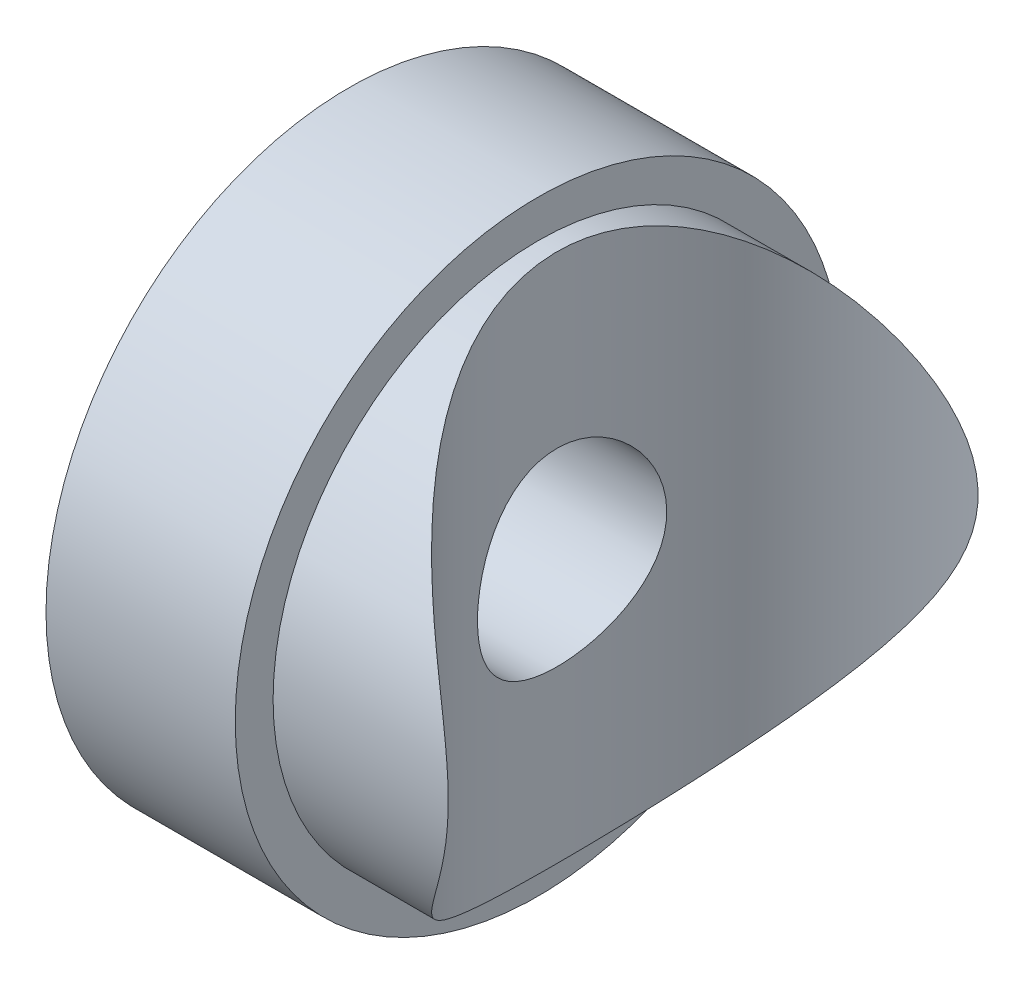
ISO-10303-21;
HEADER;
FILE_DESCRIPTION(('STEP AP214'),'2;1');
FILE_NAME('part.step','',(''),(''),'','','');
FILE_SCHEMA(('AUTOMOTIVE_DESIGN { 1 0 10303 214 1 1 1 1 }'));
ENDSEC;
DATA;
#1=APPLICATION_CONTEXT('core data for automotive mechanical design processes');
#2=APPLICATION_PROTOCOL_DEFINITION('international standard','automotive_design',2000,#1);
#3=PRODUCT_CONTEXT('',#1,'mechanical');
#4=PRODUCT('Part','Part','',(#3));
#5=PRODUCT_RELATED_PRODUCT_CATEGORY('part','',(#4));
#6=PRODUCT_DEFINITION_FORMATION('','',#4);
#7=PRODUCT_DEFINITION_CONTEXT('part definition',#1,'design');
#8=PRODUCT_DEFINITION('design','',#6,#7);
#9=PRODUCT_DEFINITION_SHAPE('','',#8);
#10=(LENGTH_UNIT() NAMED_UNIT(*) SI_UNIT(.MILLI.,.METRE.));
#11=(NAMED_UNIT(*) PLANE_ANGLE_UNIT() SI_UNIT($,.RADIAN.));
#12=(NAMED_UNIT(*) SI_UNIT($,.STERADIAN.) SOLID_ANGLE_UNIT());
#13=UNCERTAINTY_MEASURE_WITH_UNIT(LENGTH_MEASURE(1.E-05),#10,'distance_accuracy_value','');
#14=(GEOMETRIC_REPRESENTATION_CONTEXT(3) GLOBAL_UNCERTAINTY_ASSIGNED_CONTEXT((#13)) GLOBAL_UNIT_ASSIGNED_CONTEXT((#10,
#11,#12)) REPRESENTATION_CONTEXT('',''));
#15=CARTESIAN_POINT('',(0.,0.,0.));
#16=DIRECTION('',(0.,0.,1.));
#17=DIRECTION('',(1.,0.,0.));
#18=AXIS2_PLACEMENT_3D('',#15,#16,#17);
#19=CARTESIAN_POINT('',(10.,0.,0.));
#20=DIRECTION('',(-1.,0.,0.));
#21=DIRECTION('',(0.,0.,1.));
#22=AXIS2_PLACEMENT_3D('',#19,#20,#21);
#23=CYLINDRICAL_SURFACE('',#22,7.);
#24=CARTESIAN_POINT('',(5.,0.,0.));
#25=DIRECTION('',(1.,0.,0.));
#26=DIRECTION('',(0.,0.,-1.));
#27=AXIS2_PLACEMENT_3D('',#24,#25,#26);
#28=CIRCLE('',#27,7.);
#29=CARTESIAN_POINT('',(5.,0.,-7.));
#30=VERTEX_POINT('',#29);
#31=EDGE_CURVE('E10',#30,#30,#28,.T.);
#32=ORIENTED_EDGE('',*,*,#31,.T.);
#33=EDGE_LOOP('',(#32));
#34=FACE_BOUND('',#33,.T.);
#35=CARTESIAN_POINT('',(9.62701665379258,0.,7.));
#36=CARTESIAN_POINT('',(9.6270161893934,-0.112635120053914,6.99999990280088));
#37=CARTESIAN_POINT('',(9.62207662224521,-0.225276071829236,6.99727361293993));
#38=CARTESIAN_POINT('',(9.60262444537792,-0.44946347021676,6.98645716794617));
#39=CARTESIAN_POINT('',(9.58811057177819,-0.561009770353444,6.97836630464849));
#40=CARTESIAN_POINT('',(9.55029476786913,-0.782370565924877,6.95703212430416));
#41=CARTESIAN_POINT('',(9.52697070708794,-0.892179968639739,6.94377582944412));
#42=CARTESIAN_POINT('',(9.47268280425419,-1.10920553657356,6.91243058029004));
#43=CARTESIAN_POINT('',(9.44171551622252,-1.21642050807585,6.89433944588414));
#44=CARTESIAN_POINT('',(9.35824954259908,-1.47477779954107,6.84464631972935));
#45=CARTESIAN_POINT('',(9.30229047260988,-1.6243328338003,6.81060969457022));
#46=CARTESIAN_POINT('',(9.1805535771152,-1.91712809410421,6.73405916564464));
#47=CARTESIAN_POINT('',(9.11477009791143,-2.06036462211963,6.69154037584539));
#48=CARTESIAN_POINT('',(8.976035056318,-2.34119793329235,6.59854040865439));
#49=CARTESIAN_POINT('',(8.90306211289654,-2.47877605724334,6.548035193139));
#50=CARTESIAN_POINT('',(8.75234702954424,-2.74820952678169,6.43959822124493));
#51=CARTESIAN_POINT('',(8.6746052872024,-2.88006534789365,6.38166708354991));
#52=CARTESIAN_POINT('',(8.46925600058603,-3.21478348811669,6.2223002548636));
#53=CARTESIAN_POINT('',(8.33930354511534,-3.41361232707053,6.11537102512587));
#54=CARTESIAN_POINT('',(8.07673600323612,-3.79889200514321,5.88378649736237));
#55=CARTESIAN_POINT('',(7.94411950912536,-3.98533606333489,5.75912160414303));
#56=CARTESIAN_POINT('',(7.6801328152984,-4.3457884248516,5.49220564649428));
#57=CARTESIAN_POINT('',(7.5487614599441,-4.51980949609159,5.34997306042188));
#58=CARTESIAN_POINT('',(7.29038117653143,-4.85496793335145,5.04779343624745));
#59=CARTESIAN_POINT('',(7.16337031812721,-5.01611104337664,4.88785437262435));
#60=CARTESIAN_POINT('',(6.85003662867146,-5.40761857847979,4.45885019360531));
#61=CARTESIAN_POINT('',(6.66851862960557,-5.62864661784303,4.17732972773605));
#62=CARTESIAN_POINT('',(6.41748420062816,-5.93001138852198,3.72396024862766));
#63=CARTESIAN_POINT('',(6.33737033238595,-6.02540920449009,3.5677145559082));
#64=CARTESIAN_POINT('',(6.18553393985984,-6.20513864516031,3.24504548036905));
#65=CARTESIAN_POINT('',(6.11380971992169,-6.28947250644825,3.07862416456165));
#66=CARTESIAN_POINT('',(5.99276088261414,-6.43115248073762,2.76833531702067));
#67=CARTESIAN_POINT('',(5.94175629855027,-6.49059557857889,2.62607549753153));
#68=CARTESIAN_POINT('',(5.84707466706076,-6.60060999585104,2.33581291450203));
#69=CARTESIAN_POINT('',(5.80339603098248,-6.65118323884408,2.18781140465724));
#70=CARTESIAN_POINT('',(5.72412902835026,-6.74275123905286,1.88680749988892));
#71=CARTESIAN_POINT('',(5.68853792408559,-6.78374923771604,1.73380681735553));
#72=CARTESIAN_POINT('',(5.62610667069411,-6.85554598557419,1.42366460957931));
#73=CARTESIAN_POINT('',(5.59926661810922,-6.88634462224947,1.26652303867471));
#74=CARTESIAN_POINT('',(5.55477790393408,-6.93734175355161,0.948357473518675));
#75=CARTESIAN_POINT('',(5.53717906145196,-6.95748279778781,0.787317234690798));
#76=CARTESIAN_POINT('',(5.51178414910003,-6.98653293148904,0.463452664886659));
#77=CARTESIAN_POINT('',(5.50398810138572,-6.99544199556844,0.300628329878963));
#78=CARTESIAN_POINT('',(5.49837940755264,-7.00185221862717,-0.0253926446873152));
#79=CARTESIAN_POINT('',(5.50056526774087,-6.99935508443034,-0.188589224890312));
#80=CARTESIAN_POINT('',(5.51486668916304,-6.98300578647955,-0.513966449708462));
#81=CARTESIAN_POINT('',(5.52698172309489,-6.96915422571765,-0.67614714781254));
#82=CARTESIAN_POINT('',(5.55941282867884,-6.93202699006221,-0.984380214444175));
#83=CARTESIAN_POINT('',(5.57893989661536,-6.90965747554448,-1.13062681894902));
#84=CARTESIAN_POINT('',(5.62571374176344,-6.85598695846121,-1.42026191247273));
#85=CARTESIAN_POINT('',(5.65296308529589,-6.82468298670943,-1.56364943435684));
#86=CARTESIAN_POINT('',(5.71470632176022,-6.75359966491003,-1.84666436923557));
#87=CARTESIAN_POINT('',(5.74919815115209,-6.71382272894563,-1.98629284050716));
#88=CARTESIAN_POINT('',(5.82488515831042,-6.62630117380361,-2.26118809299746));
#89=CARTESIAN_POINT('',(5.86608284814397,-6.57855356857977,-2.39645321683222));
#90=CARTESIAN_POINT('',(6.0048546103848,-6.4171939399169,-2.81282036900558));
#91=CARTESIAN_POINT('',(6.11336739543133,-6.29030865695843,-3.08529700769797));
#92=CARTESIAN_POINT('',(6.35227230022199,-6.00796884327405,-3.60442427253442));
#93=CARTESIAN_POINT('',(6.4826772286036,-5.8524975823861,-3.85105964148661));
#94=CARTESIAN_POINT('',(6.72610100128193,-5.55795043366663,-4.26105902747004));
#95=CARTESIAN_POINT('',(6.83573281103501,-5.42395709110778,-4.43016423631767));
#96=CARTESIAN_POINT('',(7.06186072065336,-5.14359017699464,-4.75280612949971));
#97=CARTESIAN_POINT('',(7.17835735899519,-4.99721563386689,-4.90634158996739));
#98=CARTESIAN_POINT('',(7.41617798299427,-4.69275616750066,-5.19833291772778));
#99=CARTESIAN_POINT('',(7.53751463045988,-4.5346394499607,-5.33674513471415));
#100=CARTESIAN_POINT('',(7.78222745768636,-4.2076957565157,-5.59813370039481));
#101=CARTESIAN_POINT('',(7.90560308846307,-4.03887162986742,-5.72111412978104));
#102=CARTESIAN_POINT('',(8.13435148643422,-3.71502405384009,-5.93555619856567));
#103=CARTESIAN_POINT('',(8.23982064557465,-3.56138928190111,-6.02901900905294));
#104=CARTESIAN_POINT('',(8.44808062742766,-3.24591416095476,-6.20456672240963));
#105=CARTESIAN_POINT('',(8.55087070000389,-3.08407155036166,-6.28664846582336));
#106=CARTESIAN_POINT('',(8.75063803207512,-2.75208582907443,-6.43888756736795));
#107=CARTESIAN_POINT('',(8.84763082839802,-2.58196734615954,-6.50907781656757));
#108=CARTESIAN_POINT('',(9.03217926246574,-2.23237206035772,-6.63710550969633));
#109=CARTESIAN_POINT('',(9.11974308934868,-2.05290358237905,-6.69495371635626));
#110=CARTESIAN_POINT('',(9.28543648455813,-1.67148149404767,-6.80056775795901));
#111=CARTESIAN_POINT('',(9.36258098552176,-1.4688246823666,-6.84743223766862));
#112=CARTESIAN_POINT('',(9.45917119364571,-1.15674033893204,-6.90457229482988));
#113=CARTESIAN_POINT('',(9.48816610940651,-1.05144138733561,-6.92141876905328));
#114=CARTESIAN_POINT('',(9.53864833976433,-0.838449569378976,-6.95043446636741));
#115=CARTESIAN_POINT('',(9.56013969710613,-0.730758025463587,-6.96260620845105));
#116=CARTESIAN_POINT('',(9.59481579805696,-0.512111652289927,-6.98211598129927));
#117=CARTESIAN_POINT('',(9.60788630545393,-0.401132472843382,-6.98938759583024));
#118=CARTESIAN_POINT('',(9.62450956458244,-0.178241227773082,-6.99861891389292));
#119=CARTESIAN_POINT('',(9.62806326207444,-0.0663292559571317,-7.00057914525889));
#120=CARTESIAN_POINT('',(9.62543511041076,0.157364774340827,-6.99912487071344));
#121=CARTESIAN_POINT('',(9.61925143582239,0.269146804531572,-6.99570935702908));
#122=CARTESIAN_POINT('',(9.59752346515363,0.491506152300475,-6.98361133754373));
#123=CARTESIAN_POINT('',(9.58197771519716,0.60208328004832,-6.9749280136808));
#124=CARTESIAN_POINT('',(9.53988417971436,0.835013075576668,-6.95112482599285));
#125=CARTESIAN_POINT('',(9.51219457743241,0.957088552310848,-6.93533039653912));
#126=CARTESIAN_POINT('',(9.44765467053231,1.1979112474925,-6.89781732527256));
#127=CARTESIAN_POINT('',(9.41079717727263,1.31665577241232,-6.8760940332691));
#128=CARTESIAN_POINT('',(9.32953864000888,1.55075640400374,-6.82711535638854));
#129=CARTESIAN_POINT('',(9.28511446199344,1.66610080722349,-6.79984295463362));
#130=CARTESIAN_POINT('',(9.1904056674352,1.89293797568896,-6.74021771525886));
#131=CARTESIAN_POINT('',(9.14012225023513,2.00443152314008,-6.7078659168844));
#132=CARTESIAN_POINT('',(8.99611681718874,2.30502633348587,-6.61263981672663));
#133=CARTESIAN_POINT('',(8.89781940536147,2.49040764626621,-6.54491374389399));
#134=CARTESIAN_POINT('',(8.69308301371522,2.85104508061608,-6.39606314298767));
#135=CARTESIAN_POINT('',(8.58663809114823,3.02629364468184,-6.31492878401635));
#136=CARTESIAN_POINT('',(8.36931362008505,3.36768054935091,-6.13967253574788));
#137=CARTESIAN_POINT('',(8.25842794863783,3.53380550605122,-6.04553224295752));
#138=CARTESIAN_POINT('',(8.03524523442962,3.85709659840634,-5.84457146095725));
#139=CARTESIAN_POINT('',(7.92294856603809,4.01426505162351,-5.73775427424343));
#140=CARTESIAN_POINT('',(7.69062484007752,4.33143879142147,-5.50277227494512));
#141=CARTESIAN_POINT('',(7.57066113711254,4.49074683117711,-5.37360080319848));
#142=CARTESIAN_POINT('',(7.33405516191973,4.7988111666803,-5.10037228265977));
#143=CARTESIAN_POINT('',(7.21741350502485,4.94756551510924,-4.95631249872954));
#144=CARTESIAN_POINT('',(6.98996198862782,5.233359876781,-4.65351363810455));
#145=CARTESIAN_POINT('',(6.87914005926043,5.37042453509011,-4.49480699074535));
#146=CARTESIAN_POINT('',(6.66527346610872,5.63197553841948,-4.1623976750205));
#147=CARTESIAN_POINT('',(6.56222857985471,5.75646224327856,-3.98869543592294));
#148=CARTESIAN_POINT('',(6.39149472945843,5.96096800344605,-3.67321771153164));
#149=CARTESIAN_POINT('',(6.32153305660095,6.04418442825829,-3.53473512677032));
#150=CARTESIAN_POINT('',(6.18817940686457,6.20197549601706,-3.24992161579166));
#151=CARTESIAN_POINT('',(6.12478581680154,6.27655226148101,-3.10359263018844));
#152=CARTESIAN_POINT('',(6.0055678904129,6.41621657986907,-2.80348948709336));
#153=CARTESIAN_POINT('',(5.94974347271632,6.48130423480465,-2.64971540966268));
#154=CARTESIAN_POINT('',(5.84669517091244,6.60106091515679,-2.3354347479211));
#155=CARTESIAN_POINT('',(5.79946760076039,6.65573440629233,-2.17493108552582));
#156=CARTESIAN_POINT('',(5.71415966129734,6.75425219453694,-1.84654397709693));
#157=CARTESIAN_POINT('',(5.67616675859611,6.79799304487775,-1.67860652564989));
#158=CARTESIAN_POINT('',(5.61077050255202,6.87315689340774,-1.33795763991242));
#159=CARTESIAN_POINT('',(5.58336718751127,6.90457984704362,-1.16524618835707));
#160=CARTESIAN_POINT('',(5.53985751295615,6.95442422654225,-0.816673615248077));
#161=CARTESIAN_POINT('',(5.52374284266038,6.97285521724413,-0.640814908755219));
#162=CARTESIAN_POINT('',(5.50321220784757,6.99633104961725,-0.287535803607162));
#163=CARTESIAN_POINT('',(5.49879462082717,7.00137774782496,-0.110115624969722));
#164=CARTESIAN_POINT('',(5.50156923891914,6.99820643231774,0.220601795401311));
#165=CARTESIAN_POINT('',(5.50727904972109,6.9916821318287,0.373932200730674));
#166=CARTESIAN_POINT('',(5.52742178049601,6.96864657420993,0.67926408653266));
#167=CARTESIAN_POINT('',(5.54185459777132,6.95213543465722,0.831265582629417));
#168=CARTESIAN_POINT('',(5.57915571164869,6.90940537406274,1.13283380709221));
#169=CARTESIAN_POINT('',(5.6020237050479,6.88318680195503,1.28240062277123));
#170=CARTESIAN_POINT('',(5.65576117433385,6.8214597423298,1.57813483351604));
#171=CARTESIAN_POINT('',(5.68663098480378,6.78595086635252,1.72430208615599));
#172=CARTESIAN_POINT('',(5.75552544543652,6.70650986392006,2.01113701111503));
#173=CARTESIAN_POINT('',(5.79348461994228,6.66265475587095,2.15184180709028));
#174=CARTESIAN_POINT('',(5.87612931459442,6.56688555788207,2.42847074866197));
#175=CARTESIAN_POINT('',(5.92081739198152,6.51496840382041,2.56439305239613));
#176=CARTESIAN_POINT('',(6.06403327393434,6.34798454311575,2.96418394990067));
#177=CARTESIAN_POINT('',(6.17174606788749,6.2216472689605,3.22021157235105));
#178=CARTESIAN_POINT('',(6.37419230795015,5.98164418299052,3.64167156647441));
#179=CARTESIAN_POINT('',(6.46446220348117,5.87390927913648,3.8127772719352));
#180=CARTESIAN_POINT('',(6.65320860176237,5.64646675107773,4.14215428631665));
#181=CARTESIAN_POINT('',(6.75168828675795,5.5267544806221,4.30042057113125));
#182=CARTESIAN_POINT('',(6.95515412069933,5.27639500574932,4.6041828140485));
#183=CARTESIAN_POINT('',(7.06015338922895,5.1457255537054,4.74965149827236));
#184=CARTESIAN_POINT('',(7.27464852467416,4.87461588542339,5.02750337644319));
#185=CARTESIAN_POINT('',(7.38414382936486,4.73417688934181,5.15988819950311));
#186=CARTESIAN_POINT('',(7.60805111148922,4.44119157763416,5.41426089025911));
#187=CARTESIAN_POINT('',(7.72251774219293,4.2884578026792,5.53598424053305));
#188=CARTESIAN_POINT('',(7.95215411107542,3.9736882645187,5.76609266461807));
#189=CARTESIAN_POINT('',(8.06732400261385,3.81165040255763,5.87447471151344));
#190=CARTESIAN_POINT('',(8.29574816675449,3.47835876198522,6.07775380041093));
#191=CARTESIAN_POINT('',(8.40900444877398,3.30711555698308,6.1726658767347));
#192=CARTESIAN_POINT('',(8.63050777188266,2.95477847005465,6.34886291192024));
#193=CARTESIAN_POINT('',(8.73875742779096,2.77368984013163,6.4301550436283));
#194=CARTESIAN_POINT('',(8.96281729125683,2.37037352631602,6.59058565727503));
#195=CARTESIAN_POINT('',(9.07701537517177,2.14623127732212,6.66724593029085));
#196=CARTESIAN_POINT('',(9.28272068359942,1.68184415668582,6.79922499114861));
#197=CARTESIAN_POINT('',(9.37427352316833,1.44163291480077,6.85458680825673));
#198=CARTESIAN_POINT('',(9.50382963224132,1.0013725222471,6.93073398766374));
#199=CARTESIAN_POINT('',(9.54925365506874,0.804486129667294,6.95650181323955));
#200=CARTESIAN_POINT('',(9.59549867892122,0.504908487287218,6.98248883735962));
#201=CARTESIAN_POINT('',(9.60726472842783,0.404396789898094,6.98904026710865));
#202=CARTESIAN_POINT('',(9.62302261709819,0.202591450914351,6.99779516082333));
#203=CARTESIAN_POINT('',(9.6270170714487,0.101298083879524,7.00000008741576));
#204=CARTESIAN_POINT('',(9.62701665379258,0.,7.));
#205=B_SPLINE_CURVE_WITH_KNOTS('',3,(#35,#36,#37,#38,#39,#40,#41,#42,#43,#44,#45,#46,#47,#48,
#49,#50,#51,#52,#53,#54,#55,#56,#57,#58,#59,#60,#61,#62,#63,#64,#65,#66,#67,#68,#69,#70,#71,#72,
#73,#74,#75,#76,#77,#78,#79,#80,#81,#82,#83,#84,#85,#86,#87,#88,#89,#90,#91,#92,#93,#94,#95,#96,
#97,#98,#99,#100,#101,#102,#103,#104,#105,#106,#107,#108,#109,#110,#111,#112,#113,#114,#115,
#116,#117,#118,#119,#120,#121,#122,#123,#124,#125,#126,#127,#128,#129,#130,#131,#132,#133,#134,
#135,#136,#137,#138,#139,#140,#141,#142,#143,#144,#145,#146,#147,#148,#149,#150,#151,#152,#153,
#154,#155,#156,#157,#158,#159,#160,#161,#162,#163,#164,#165,#166,#167,#168,#169,#170,#171,#172,
#173,#174,#175,#176,#177,#178,#179,#180,#181,#182,#183,#184,#185,#186,#187,#188,#189,#190,#191,
#192,#193,#194,#195,#196,#197,#198,#199,#200,#201,#202,#203,#204),.UNSPECIFIED.,.T.,.F.,(4,2,2,
2,2,2,2,2,2,2,2,2,2,2,2,2,2,2,2,2,2,2,2,2,2,2,2,2,2,2,2,2,2,2,2,2,2,2,2,2,2,2,2,2,2,2,2,2,2,2,2,
2,2,2,2,2,2,2,2,2,2,2,2,2,2,2,2,2,2,2,2,2,2,2,2,2,2,2,2,2,2,2,2,2,4),(0.,0.337778939486124,
0.675602477263585,1.01428030505626,1.35311110690155,1.84208554724189,2.33134247207005,
2.82210105539178,3.31281877817114,4.09322407208084,4.87405319105318,5.65406788933482,
6.43373271006966,7.63237433341099,8.2312843382148,8.83007308579137,9.31680264874053,
9.80342652615226,10.2898854302847,10.7763497008681,11.2654102391627,11.7544718827911,
12.2434603456187,12.7324228417404,13.1796146955335,13.6269553378925,14.074168695809,
14.5215499704951,15.4764267912272,16.431864250121,17.1569775790701,17.882147861753,
18.6093587984386,19.3363770286357,19.9613564284486,20.5865089805806,21.2099031267501,
21.8327514072068,22.4961411542637,22.8273576355045,23.1583953885394,23.4938343270591,
23.8292399291287,24.1647084160546,24.5002290127325,24.8781372736492,25.2563427957831,
25.6357260913487,26.0150318659389,26.6754390513615,27.3363326103951,27.998171104033,
28.6598375570385,29.3719488170744,30.084191132708,30.7948926805622,31.5055738904129,
32.0332979880905,32.5608921628669,33.0884806653909,33.6158424197682,34.1480198258315,
34.6801991567395,35.2119862804714,35.743699636103,36.2038571088266,36.664009164132,
37.1241446808584,37.5842994405194,38.0403975157815,38.49666936531,39.4087844926326,
40.0723068654028,40.7360876366511,41.4012504003502,42.0663302379104,42.7448649843432,
43.4235533961697,44.1014782393415,44.7790449282948,45.5662795694897,46.3519153022981,
46.9603382392477,47.2642210708318,47.5680016263852),.UNSPECIFIED.);
#206=CARTESIAN_POINT('',(9.62701665379258,0.,7.));
#207=VERTEX_POINT('',#206);
#208=EDGE_CURVE('E70',#207,#207,#205,.T.);
#209=ORIENTED_EDGE('',*,*,#208,.F.);
#210=EDGE_LOOP('',(#209));
#211=FACE_BOUND('',#210,.T.);
#212=ADVANCED_FACE('F43',(#34,#211),#23,.T.);
#213=CARTESIAN_POINT('',(5.,0.,0.));
#214=DIRECTION('',(-1.,0.,0.));
#215=DIRECTION('',(0.,0.,1.));
#216=AXIS2_PLACEMENT_3D('',#213,#214,#215);
#217=CYLINDRICAL_SURFACE('',#216,8.);
#218=CARTESIAN_POINT('',(5.,0.,0.));
#219=DIRECTION('',(1.,0.,0.));
#220=DIRECTION('',(0.,0.,-1.));
#221=AXIS2_PLACEMENT_3D('',#218,#219,#220);
#222=CIRCLE('',#221,8.);
#223=CARTESIAN_POINT('',(5.,0.,-8.));
#224=VERTEX_POINT('',#223);
#225=EDGE_CURVE('E57',#224,#224,#222,.T.);
#226=ORIENTED_EDGE('',*,*,#225,.F.);
#227=EDGE_LOOP('',(#226));
#228=FACE_BOUND('',#227,.T.);
#229=CARTESIAN_POINT('',(0.,0.,0.));
#230=DIRECTION('',(1.,0.,0.));
#231=DIRECTION('',(0.,0.,-1.));
#232=AXIS2_PLACEMENT_3D('',#229,#230,#231);
#233=CIRCLE('',#232,8.);
#234=CARTESIAN_POINT('',(0.,0.,-8.));
#235=VERTEX_POINT('',#234);
#236=EDGE_CURVE('E63',#235,#235,#233,.T.);
#237=ORIENTED_EDGE('',*,*,#236,.T.);
#238=EDGE_LOOP('',(#237));
#239=FACE_BOUND('',#238,.T.);
#240=ADVANCED_FACE('F45',(#228,#239),#217,.T.);
#241=CARTESIAN_POINT('',(5.,0.,0.));
#242=DIRECTION('',(1.,0.,0.));
#243=DIRECTION('',(0.,0.,-1.));
#244=AXIS2_PLACEMENT_3D('',#241,#242,#243);
#245=PLANE('',#244);
#246=ORIENTED_EDGE('',*,*,#31,.F.);
#247=EDGE_LOOP('',(#246));
#248=FACE_BOUND('',#247,.T.);
#249=ORIENTED_EDGE('',*,*,#225,.T.);
#250=EDGE_LOOP('',(#249));
#251=FACE_BOUND('',#250,.T.);
#252=ADVANCED_FACE('F99',(#248,#251),#245,.T.);
#253=CARTESIAN_POINT('',(0.,0.,0.));
#254=DIRECTION('',(1.,0.,0.));
#255=DIRECTION('',(0.,0.,-1.));
#256=AXIS2_PLACEMENT_3D('',#253,#254,#255);
#257=PLANE('',#256);
#258=CARTESIAN_POINT('',(0.,0.,0.));
#259=DIRECTION('',(-1.,0.,0.));
#260=DIRECTION('',(0.,0.,1.));
#261=AXIS2_PLACEMENT_3D('',#258,#259,#260);
#262=CIRCLE('',#261,2.5);
#263=CARTESIAN_POINT('',(0.,0.,2.5));
#264=VERTEX_POINT('',#263);
#265=EDGE_CURVE('E66',#264,#264,#262,.T.);
#266=ORIENTED_EDGE('',*,*,#265,.F.);
#267=EDGE_LOOP('',(#266));
#268=FACE_BOUND('',#267,.T.);
#269=ORIENTED_EDGE('',*,*,#236,.F.);
#270=EDGE_LOOP('',(#269));
#271=FACE_BOUND('',#270,.T.);
#272=ADVANCED_FACE('F83',(#268,#271),#257,.F.);
#273=CARTESIAN_POINT('',(13.5,8.,0.));
#274=DIRECTION('',(0.,-1.,0.));
#275=DIRECTION('',(0.,0.,-1.));
#276=AXIS2_PLACEMENT_3D('',#273,#274,#275);
#277=CYLINDRICAL_SURFACE('',#276,8.);
#278=CARTESIAN_POINT('',(5.90065792321467,0.,2.5));
#279=CARTESIAN_POINT('',(5.90065708076128,-0.136694072218673,2.49999907560094));
#280=CARTESIAN_POINT('',(5.89692936989915,-0.2733975374064,2.48875077582989));
#281=CARTESIAN_POINT('',(5.88248722002246,-0.542788321755614,2.44418350802654));
#282=CARTESIAN_POINT('',(5.87177089293728,-0.675474545464321,2.4108585756503));
#283=CARTESIAN_POINT('',(5.84468122328081,-0.932889803864,2.32339576447118));
#284=CARTESIAN_POINT('',(5.82831789611367,-1.05763246621136,2.26929471473354));
#285=CARTESIAN_POINT('',(5.79179187562623,-1.29630539172803,2.14193828346314));
#286=CARTESIAN_POINT('',(5.77162851128319,-1.41023373992025,2.06867951811264));
#287=CARTESIAN_POINT('',(5.7289974466276,-1.62795773498697,1.90239214124459));
#288=CARTESIAN_POINT('',(5.70647753230439,-1.73132721887197,1.8088187994408));
#289=CARTESIAN_POINT('',(5.66211508279329,-1.92119202641837,1.60572409291099));
#290=CARTESIAN_POINT('',(5.64027264254746,-2.00768499388969,1.49620050503713));
#291=CARTESIAN_POINT('',(5.59912893219844,-2.16322212602249,1.26125182498673));
#292=CARTESIAN_POINT('',(5.5798963087444,-2.23182740766291,1.13552311304019));
#293=CARTESIAN_POINT('',(5.54674896333962,-2.3467520997111,0.873608465706808));
#294=CARTESIAN_POINT('',(5.5328329916016,-2.39307674829917,0.737424996974104));
#295=CARTESIAN_POINT('',(5.51225648358276,-2.46070225619414,0.462928713932197));
#296=CARTESIAN_POINT('',(5.50538522031717,-2.4827314995757,0.324811430936433));
#297=CARTESIAN_POINT('',(5.49892808247967,-2.50344869287505,0.0466816279690398));
#298=CARTESIAN_POINT('',(5.49934055179859,-2.50214194871765,-0.093330453946172));
#299=CARTESIAN_POINT('',(5.50725767734937,-2.47670341682812,-0.366148960709463));
#300=CARTESIAN_POINT('',(5.51451698055726,-2.453361232974,-0.499037268628065));
#301=CARTESIAN_POINT('',(5.5350103487825,-2.38581001991396,-0.758906126695561));
#302=CARTESIAN_POINT('',(5.54824480345581,-2.34159962982675,-0.885886290962471));
#303=CARTESIAN_POINT('',(5.57953080541087,-2.23305962185038,-1.13215620630948));
#304=CARTESIAN_POINT('',(5.59763932766659,-2.16849038287449,-1.25133281124536));
#305=CARTESIAN_POINT('',(5.63676554092303,-2.02125780059032,-1.47740502230436));
#306=CARTESIAN_POINT('',(5.65778396708691,-1.93858988172226,-1.58429751241882));
#307=CARTESIAN_POINT('',(5.70152658532937,-1.75345273039957,-1.78747539690657));
#308=CARTESIAN_POINT('',(5.72428536030314,-1.65030186232582,-1.88313309818382));
#309=CARTESIAN_POINT('',(5.76818769110692,-1.42920979634286,-2.05597948519529));
#310=CARTESIAN_POINT('',(5.78933105648604,-1.31126685881929,-2.13316599552377));
#311=CARTESIAN_POINT('',(5.8277830673421,-1.06216506230485,-2.26760930038169));
#312=CARTESIAN_POINT('',(5.84504619411806,-0.930873182018058,-2.32463361399527));
#313=CARTESIAN_POINT('',(5.87324909442301,-0.659881016315987,-2.41556691891091));
#314=CARTESIAN_POINT('',(5.88419113964977,-0.52018377161125,-2.44948421530003));
#315=CARTESIAN_POINT('',(5.89800873185918,-0.24236009484572,-2.4920297037281));
#316=CARTESIAN_POINT('',(5.90119067212488,-0.104396007529734,-2.50161908707794));
#317=CARTESIAN_POINT('',(5.8999784508015,0.171179482990277,-2.49793488996242));
#318=CARTESIAN_POINT('',(5.89558545985367,0.308790937399332,-2.48466484222813));
#319=CARTESIAN_POINT('',(5.88002085032167,0.575616593304846,-2.43649747026382));
#320=CARTESIAN_POINT('',(5.86904891795977,0.704958548148403,-2.40223662321101));
#321=CARTESIAN_POINT('',(5.84177425337238,0.95604358399167,-2.31380747322029));
#322=CARTESIAN_POINT('',(5.82547065175377,1.07778542184227,-2.25963592342302));
#323=CARTESIAN_POINT('',(5.78878920693532,1.31407821954362,-2.13115021311757));
#324=CARTESIAN_POINT('',(5.76830793020492,1.42832283118558,-2.05630294977117));
#325=CARTESIAN_POINT('',(5.72579302054385,1.6429806927238,-1.8892128173596));
#326=CARTESIAN_POINT('',(5.70375898528606,1.74339033785067,-1.79696542938156));
#327=CARTESIAN_POINT('',(5.65951624874629,1.93182073182564,-1.59314589550721));
#328=CARTESIAN_POINT('',(5.63733815428638,2.01915557227973,-1.48093129957704));
#329=CARTESIAN_POINT('',(5.59621880312647,2.17378208664251,-1.24290309130279));
#330=CARTESIAN_POINT('',(5.57727739818109,2.24107467862207,-1.11709010221725));
#331=CARTESIAN_POINT('',(5.54487376142975,2.35306112494336,-0.856211046663664));
#332=CARTESIAN_POINT('',(5.53137200877599,2.39791857568736,-0.721220368567512));
#333=CARTESIAN_POINT('',(5.51119514702848,2.46414507717941,-0.445114508112779));
#334=CARTESIAN_POINT('',(5.50451790171445,2.48552147816699,-0.304001256680713));
#335=CARTESIAN_POINT('',(5.49888393191077,2.50358200349924,-0.0259698732977977));
#336=CARTESIAN_POINT('',(5.49961741185221,2.50125690034152,0.110878383893045));
#337=CARTESIAN_POINT('',(5.50798043837903,2.47437637790261,0.382146443846496));
#338=CARTESIAN_POINT('',(5.51560953534762,2.44982240801611,0.516566404359137));
#339=CARTESIAN_POINT('',(5.53680858310409,2.37981198155545,0.777510236961582));
#340=CARTESIAN_POINT('',(5.5503030407959,2.33462078430926,0.904111836898962));
#341=CARTESIAN_POINT('',(5.581841088241,2.22485834558305,1.14799685100018));
#342=CARTESIAN_POINT('',(5.59988545817284,2.16028378005314,1.26527866254896));
#343=CARTESIAN_POINT('',(5.63940206233248,2.01105448331112,1.49152338993938));
#344=CARTESIAN_POINT('',(5.66096980498076,1.92579295507205,1.60006921410622));
#345=CARTESIAN_POINT('',(5.70482526905878,1.73868022111307,1.80164158279864));
#346=CARTESIAN_POINT('',(5.72711320430347,1.63682405172123,1.89466346700832));
#347=CARTESIAN_POINT('',(5.77076214845124,1.4153685603178,2.06565731822505));
#348=CARTESIAN_POINT('',(5.79206798273088,1.29529319376685,2.14302855989422));
#349=CARTESIAN_POINT('',(5.83039749440938,1.04320375946172,2.27640941497043));
#350=CARTESIAN_POINT('',(5.84742290277227,0.911194547099498,2.33242766807092));
#351=CARTESIAN_POINT('',(5.87386879119345,0.650554765370659,2.41742360871585));
#352=CARTESIAN_POINT('',(5.88381369912502,0.52259490509687,2.44829879675747));
#353=CARTESIAN_POINT('',(5.89720787035203,0.26309233580702,2.48958491632199));
#354=CARTESIAN_POINT('',(5.90065873396804,0.131550517597004,2.50000088961557));
#355=CARTESIAN_POINT('',(5.90065792321467,0.,2.5));
#356=B_SPLINE_CURVE_WITH_KNOTS('',3,(#278,#279,#280,#281,#282,#283,#284,#285,#286,#287,#288,
#289,#290,#291,#292,#293,#294,#295,#296,#297,#298,#299,#300,#301,#302,#303,#304,#305,#306,#307,
#308,#309,#310,#311,#312,#313,#314,#315,#316,#317,#318,#319,#320,#321,#322,#323,#324,#325,#326,
#327,#328,#329,#330,#331,#332,#333,#334,#335,#336,#337,#338,#339,#340,#341,#342,#343,#344,#345,
#346,#347,#348,#349,#350,#351,#352,#353,#354,#355),.UNSPECIFIED.,.T.,.F.,(4,2,2,2,2,2,2,2,2,2,2,
2,2,2,2,2,2,2,2,2,2,2,2,2,2,2,2,2,2,2,2,2,2,2,2,2,2,2,4),(0.,0.40959627509698,0.819303254119471,
1.22828728823716,1.6373436098499,2.05914161101677,2.48099845882245,2.91239643927466,
3.34369294835844,3.76167445671067,4.17956092943549,4.58301965939501,4.98650470380186,
5.39492809216818,5.80345485426375,6.22900677874668,6.65460879707552,7.08496941871144,
7.5151752791037,7.92809866580735,8.34095824443043,8.7418794409359,9.14286604511284,
9.55535226624085,9.96794576028624,10.3976387562789,10.8273120663904,11.2538047858686,
11.6801639628603,12.0887760488391,12.4973614938948,12.9008369303438,13.3043815982817,
13.7216138621529,14.1389711554925,14.5701559100827,15.0011660161251,15.3954470874764,
15.7896309838242),.UNSPECIFIED.);
#357=CARTESIAN_POINT('',(5.90065792321467,0.,2.5));
#358=VERTEX_POINT('',#357);
#359=EDGE_CURVE('E47',#358,#358,#356,.T.);
#360=ORIENTED_EDGE('',*,*,#359,.F.);
#361=EDGE_LOOP('',(#360));
#362=FACE_BOUND('',#361,.T.);
#363=ORIENTED_EDGE('',*,*,#208,.T.);
#364=EDGE_LOOP('',(#363));
#365=FACE_BOUND('',#364,.T.);
#366=ADVANCED_FACE('F79',(#362,#365),#277,.F.);
#367=CARTESIAN_POINT('',(15.,0.,0.));
#368=DIRECTION('',(-1.,0.,0.));
#369=DIRECTION('',(0.,0.,1.));
#370=AXIS2_PLACEMENT_3D('',#367,#368,#369);
#371=CYLINDRICAL_SURFACE('',#370,2.5);
#372=ORIENTED_EDGE('',*,*,#359,.T.);
#373=EDGE_LOOP('',(#372));
#374=FACE_BOUND('',#373,.T.);
#375=ORIENTED_EDGE('',*,*,#265,.T.);
#376=EDGE_LOOP('',(#375));
#377=FACE_BOUND('',#376,.T.);
#378=ADVANCED_FACE('F82',(#374,#377),#371,.F.);
#379=CLOSED_SHELL('',(#212,#240,#252,#272,#366,#378));
#380=MANIFOLD_SOLID_BREP('B2',#379);
#381=ADVANCED_BREP_SHAPE_REPRESENTATION('',(#18,#380),#14);
#382=SHAPE_DEFINITION_REPRESENTATION(#9,#381);
ENDSEC;
END-ISO-10303-21;
